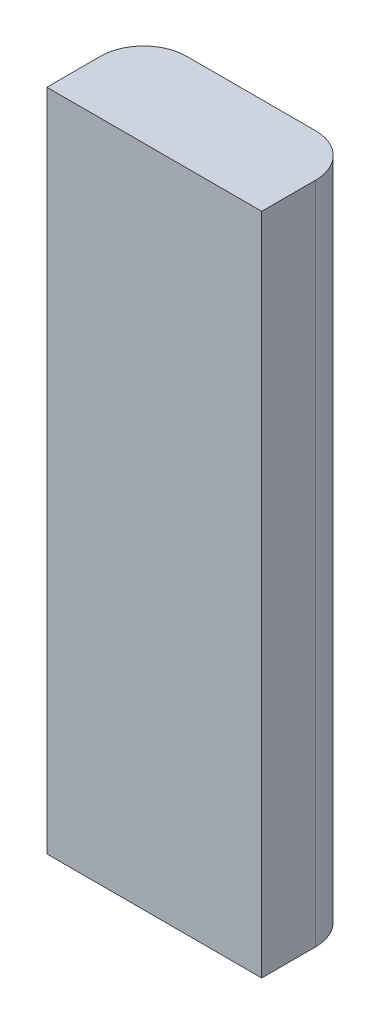
ISO-10303-21;
HEADER;
FILE_DESCRIPTION(('STEP AP214'),'2;1');
FILE_NAME('part.step','',(''),(''),'','','');
FILE_SCHEMA(('AUTOMOTIVE_DESIGN { 1 0 10303 214 1 1 1 1 }'));
ENDSEC;
DATA;
#1=APPLICATION_CONTEXT('core data for automotive mechanical design processes');
#2=APPLICATION_PROTOCOL_DEFINITION('international standard','automotive_design',2000,#1);
#3=PRODUCT_CONTEXT('',#1,'mechanical');
#4=PRODUCT('Part','Part','',(#3));
#5=PRODUCT_RELATED_PRODUCT_CATEGORY('part','',(#4));
#6=PRODUCT_DEFINITION_FORMATION('','',#4);
#7=PRODUCT_DEFINITION_CONTEXT('part definition',#1,'design');
#8=PRODUCT_DEFINITION('design','',#6,#7);
#9=PRODUCT_DEFINITION_SHAPE('','',#8);
#10=(LENGTH_UNIT() NAMED_UNIT(*) SI_UNIT(.MILLI.,.METRE.));
#11=(NAMED_UNIT(*) PLANE_ANGLE_UNIT() SI_UNIT($,.RADIAN.));
#12=(NAMED_UNIT(*) SI_UNIT($,.STERADIAN.) SOLID_ANGLE_UNIT());
#13=UNCERTAINTY_MEASURE_WITH_UNIT(LENGTH_MEASURE(1.E-05),#10,'distance_accuracy_value','');
#14=(GEOMETRIC_REPRESENTATION_CONTEXT(3) GLOBAL_UNCERTAINTY_ASSIGNED_CONTEXT((#13)) GLOBAL_UNIT_ASSIGNED_CONTEXT((#10,
#11,#12)) REPRESENTATION_CONTEXT('',''));
#15=CARTESIAN_POINT('',(0.,0.,0.));
#16=DIRECTION('',(0.,0.,1.));
#17=DIRECTION('',(1.,0.,0.));
#18=AXIS2_PLACEMENT_3D('',#15,#16,#17);
#19=CARTESIAN_POINT('',(0.,392.43,0.));
#20=DIRECTION('',(1.,0.,0.));
#21=DIRECTION('',(0.,0.,-1.));
#22=AXIS2_PLACEMENT_3D('',#19,#20,#21);
#23=PLANE('',#22);
#24=DIRECTION('',(0.,0.,1.));
#25=VECTOR('',#24,1.);
#26=CARTESIAN_POINT('',(0.,0.,0.));
#27=LINE('',#26,#25);
#28=CARTESIAN_POINT('',(0.,0.,-31.7499999999998));
#29=VERTEX_POINT('',#28);
#30=CARTESIAN_POINT('',(0.,0.,0.));
#31=VERTEX_POINT('',#30);
#32=EDGE_CURVE('E131',#29,#31,#27,.T.);
#33=ORIENTED_EDGE('',*,*,#32,.T.);
#34=DIRECTION('',(0.,-1.,0.));
#35=VECTOR('',#34,1.);
#36=CARTESIAN_POINT('',(0.,392.43,0.));
#37=LINE('',#36,#35);
#38=CARTESIAN_POINT('',(0.,392.43,0.));
#39=VERTEX_POINT('',#38);
#40=EDGE_CURVE('E11',#39,#31,#37,.T.);
#41=ORIENTED_EDGE('',*,*,#40,.F.);
#42=DIRECTION('',(0.,0.,1.));
#43=VECTOR('',#42,1.);
#44=CARTESIAN_POINT('',(0.,392.43,0.));
#45=LINE('',#44,#43);
#46=CARTESIAN_POINT('',(0.,392.43,-31.7499999999998));
#47=VERTEX_POINT('',#46);
#48=EDGE_CURVE('E141',#47,#39,#45,.T.);
#49=ORIENTED_EDGE('',*,*,#48,.F.);
#50=DIRECTION('',(0.,-1.,0.));
#51=VECTOR('',#50,1.);
#52=CARTESIAN_POINT('',(0.,392.43,-31.7499999999998));
#53=LINE('',#52,#51);
#54=EDGE_CURVE('E127',#47,#29,#53,.T.);
#55=ORIENTED_EDGE('',*,*,#54,.T.);
#56=EDGE_LOOP('',(#33,#41,#49,#55));
#57=FACE_BOUND('',#56,.T.);
#58=ADVANCED_FACE('F47',(#57),#23,.F.);
#59=CARTESIAN_POINT('',(0.,392.43,0.));
#60=DIRECTION('',(0.,0.,-1.));
#61=DIRECTION('',(-1.,0.,0.));
#62=AXIS2_PLACEMENT_3D('',#59,#60,#61);
#63=PLANE('',#62);
#64=DIRECTION('',(1.,0.,0.));
#65=VECTOR('',#64,1.);
#66=CARTESIAN_POINT('',(0.,0.,0.));
#67=LINE('',#66,#65);
#68=CARTESIAN_POINT('',(127.,0.,0.));
#69=VERTEX_POINT('',#68);
#70=EDGE_CURVE('E134',#31,#69,#67,.T.);
#71=ORIENTED_EDGE('',*,*,#70,.T.);
#72=DIRECTION('',(0.,-1.,0.));
#73=VECTOR('',#72,1.);
#74=CARTESIAN_POINT('',(127.,392.43,0.));
#75=LINE('',#74,#73);
#76=CARTESIAN_POINT('',(127.,392.43,0.));
#77=VERTEX_POINT('',#76);
#78=EDGE_CURVE('E55',#77,#69,#75,.T.);
#79=ORIENTED_EDGE('',*,*,#78,.F.);
#80=DIRECTION('',(1.,0.,0.));
#81=VECTOR('',#80,1.);
#82=CARTESIAN_POINT('',(0.,392.43,0.));
#83=LINE('',#82,#81);
#84=EDGE_CURVE('E100',#39,#77,#83,.T.);
#85=ORIENTED_EDGE('',*,*,#84,.F.);
#86=ORIENTED_EDGE('',*,*,#40,.T.);
#87=EDGE_LOOP('',(#71,#79,#85,#86));
#88=FACE_BOUND('',#87,.T.);
#89=ADVANCED_FACE('F165',(#88),#63,.F.);
#90=CARTESIAN_POINT('',(127.,392.43,0.));
#91=DIRECTION('',(-1.,0.,0.));
#92=DIRECTION('',(0.,0.,1.));
#93=AXIS2_PLACEMENT_3D('',#90,#91,#92);
#94=PLANE('',#93);
#95=DIRECTION('',(0.,0.,-1.));
#96=VECTOR('',#95,1.);
#97=CARTESIAN_POINT('',(127.,0.,0.));
#98=LINE('',#97,#96);
#99=CARTESIAN_POINT('',(127.,0.,-31.7499999999998));
#100=VERTEX_POINT('',#99);
#101=EDGE_CURVE('E136',#69,#100,#98,.T.);
#102=ORIENTED_EDGE('',*,*,#101,.T.);
#103=DIRECTION('',(0.,-1.,0.));
#104=VECTOR('',#103,1.);
#105=CARTESIAN_POINT('',(127.,392.43,-31.7499999999998));
#106=LINE('',#105,#104);
#107=CARTESIAN_POINT('',(127.,392.43,-31.7499999999998));
#108=VERTEX_POINT('',#107);
#109=EDGE_CURVE('E122',#108,#100,#106,.T.);
#110=ORIENTED_EDGE('',*,*,#109,.F.);
#111=DIRECTION('',(0.,0.,-1.));
#112=VECTOR('',#111,1.);
#113=CARTESIAN_POINT('',(127.,392.43,0.));
#114=LINE('',#113,#112);
#115=EDGE_CURVE('E113',#77,#108,#114,.T.);
#116=ORIENTED_EDGE('',*,*,#115,.F.);
#117=ORIENTED_EDGE('',*,*,#78,.T.);
#118=EDGE_LOOP('',(#102,#110,#116,#117));
#119=FACE_BOUND('',#118,.T.);
#120=ADVANCED_FACE('F147',(#119),#94,.F.);
#121=CARTESIAN_POINT('',(101.6,392.43,-31.75));
#122=DIRECTION('',(0.,-1.,0.));
#123=DIRECTION('',(0.,0.,-1.));
#124=AXIS2_PLACEMENT_3D('',#121,#122,#123);
#125=CYLINDRICAL_SURFACE('',#124,25.4);
#126=CARTESIAN_POINT('',(101.6,0.,-31.75));
#127=DIRECTION('',(0.,1.,0.));
#128=DIRECTION('',(0.,0.,-1.));
#129=AXIS2_PLACEMENT_3D('',#126,#127,#128);
#130=CIRCLE('',#129,25.4);
#131=CARTESIAN_POINT('',(101.6,0.,-57.15));
#132=VERTEX_POINT('',#131);
#133=EDGE_CURVE('E121',#100,#132,#130,.T.);
#134=ORIENTED_EDGE('',*,*,#133,.T.);
#135=DIRECTION('',(0.,-1.,0.));
#136=VECTOR('',#135,1.);
#137=CARTESIAN_POINT('',(101.6,392.43,-57.15));
#138=LINE('',#137,#136);
#139=CARTESIAN_POINT('',(101.6,392.43,-57.15));
#140=VERTEX_POINT('',#139);
#141=EDGE_CURVE('E118',#140,#132,#138,.T.);
#142=ORIENTED_EDGE('',*,*,#141,.F.);
#143=CARTESIAN_POINT('',(101.6,392.43,-31.75));
#144=DIRECTION('',(0.,1.,0.));
#145=DIRECTION('',(0.,0.,-1.));
#146=AXIS2_PLACEMENT_3D('',#143,#144,#145);
#147=CIRCLE('',#146,25.4);
#148=EDGE_CURVE('E107',#108,#140,#147,.T.);
#149=ORIENTED_EDGE('',*,*,#148,.F.);
#150=ORIENTED_EDGE('',*,*,#109,.T.);
#151=EDGE_LOOP('',(#134,#142,#149,#150));
#152=FACE_BOUND('',#151,.T.);
#153=ADVANCED_FACE('F119',(#152),#125,.T.);
#154=CARTESIAN_POINT('',(25.4000000000002,392.43,-57.15));
#155=DIRECTION('',(0.,0.,1.));
#156=DIRECTION('',(1.,0.,0.));
#157=AXIS2_PLACEMENT_3D('',#154,#155,#156);
#158=PLANE('',#157);
#159=DIRECTION('',(-1.,0.,0.));
#160=VECTOR('',#159,1.);
#161=CARTESIAN_POINT('',(25.4000000000002,0.,-57.15));
#162=LINE('',#161,#160);
#163=CARTESIAN_POINT('',(25.4000000000002,0.,-57.15));
#164=VERTEX_POINT('',#163);
#165=EDGE_CURVE('E86',#132,#164,#162,.T.);
#166=ORIENTED_EDGE('',*,*,#165,.T.);
#167=DIRECTION('',(0.,-1.,0.));
#168=VECTOR('',#167,1.);
#169=CARTESIAN_POINT('',(25.4000000000002,392.43,-57.15));
#170=LINE('',#169,#168);
#171=CARTESIAN_POINT('',(25.4000000000002,392.43,-57.15));
#172=VERTEX_POINT('',#171);
#173=EDGE_CURVE('E123',#172,#164,#170,.T.);
#174=ORIENTED_EDGE('',*,*,#173,.F.);
#175=DIRECTION('',(-1.,0.,0.));
#176=VECTOR('',#175,1.);
#177=CARTESIAN_POINT('',(25.4000000000002,392.43,-57.15));
#178=LINE('',#177,#176);
#179=EDGE_CURVE('E111',#140,#172,#178,.T.);
#180=ORIENTED_EDGE('',*,*,#179,.F.);
#181=ORIENTED_EDGE('',*,*,#141,.T.);
#182=EDGE_LOOP('',(#166,#174,#180,#181));
#183=FACE_BOUND('',#182,.T.);
#184=ADVANCED_FACE('F125',(#183),#158,.F.);
#185=CARTESIAN_POINT('',(25.4,392.43,-31.75));
#186=DIRECTION('',(0.,-1.,0.));
#187=DIRECTION('',(0.,0.,-1.));
#188=AXIS2_PLACEMENT_3D('',#185,#186,#187);
#189=CYLINDRICAL_SURFACE('',#188,25.4);
#190=CARTESIAN_POINT('',(25.4,0.,-31.75));
#191=DIRECTION('',(0.,1.,0.));
#192=DIRECTION('',(0.,0.,-1.));
#193=AXIS2_PLACEMENT_3D('',#190,#191,#192);
#194=CIRCLE('',#193,25.4);
#195=EDGE_CURVE('E92',#164,#29,#194,.T.);
#196=ORIENTED_EDGE('',*,*,#195,.T.);
#197=ORIENTED_EDGE('',*,*,#54,.F.);
#198=CARTESIAN_POINT('',(25.4,392.43,-31.75));
#199=DIRECTION('',(0.,1.,0.));
#200=DIRECTION('',(0.,0.,-1.));
#201=AXIS2_PLACEMENT_3D('',#198,#199,#200);
#202=CIRCLE('',#201,25.4);
#203=EDGE_CURVE('E63',#172,#47,#202,.T.);
#204=ORIENTED_EDGE('',*,*,#203,.F.);
#205=ORIENTED_EDGE('',*,*,#173,.T.);
#206=EDGE_LOOP('',(#196,#197,#204,#205));
#207=FACE_BOUND('',#206,.T.);
#208=ADVANCED_FACE('F154',(#207),#189,.T.);
#209=CARTESIAN_POINT('',(25.4,392.43,-31.75));
#210=DIRECTION('',(0.,-1.,0.));
#211=DIRECTION('',(0.,0.,-1.));
#212=AXIS2_PLACEMENT_3D('',#209,#210,#211);
#213=PLANE('',#212);
#214=ORIENTED_EDGE('',*,*,#48,.T.);
#215=ORIENTED_EDGE('',*,*,#84,.T.);
#216=ORIENTED_EDGE('',*,*,#115,.T.);
#217=ORIENTED_EDGE('',*,*,#148,.T.);
#218=ORIENTED_EDGE('',*,*,#179,.T.);
#219=ORIENTED_EDGE('',*,*,#203,.T.);
#220=EDGE_LOOP('',(#214,#215,#216,#217,#218,#219));
#221=FACE_BOUND('',#220,.T.);
#222=ADVANCED_FACE('F109',(#221),#213,.F.);
#223=CARTESIAN_POINT('',(25.4,0.,-31.75));
#224=DIRECTION('',(0.,-1.,0.));
#225=DIRECTION('',(0.,0.,-1.));
#226=AXIS2_PLACEMENT_3D('',#223,#224,#225);
#227=PLANE('',#226);
#228=ORIENTED_EDGE('',*,*,#32,.F.);
#229=ORIENTED_EDGE('',*,*,#195,.F.);
#230=ORIENTED_EDGE('',*,*,#165,.F.);
#231=ORIENTED_EDGE('',*,*,#133,.F.);
#232=ORIENTED_EDGE('',*,*,#101,.F.);
#233=ORIENTED_EDGE('',*,*,#70,.F.);
#234=EDGE_LOOP('',(#228,#229,#230,#231,#232,#233));
#235=FACE_BOUND('',#234,.T.);
#236=ADVANCED_FACE('F150',(#235),#227,.T.);
#237=CLOSED_SHELL('',(#58,#89,#120,#153,#184,#208,#222,#236));
#238=MANIFOLD_SOLID_BREP('B2',#237);
#239=ADVANCED_BREP_SHAPE_REPRESENTATION('',(#18,#238),#14);
#240=SHAPE_DEFINITION_REPRESENTATION(#9,#239);
ENDSEC;
END-ISO-10303-21;
